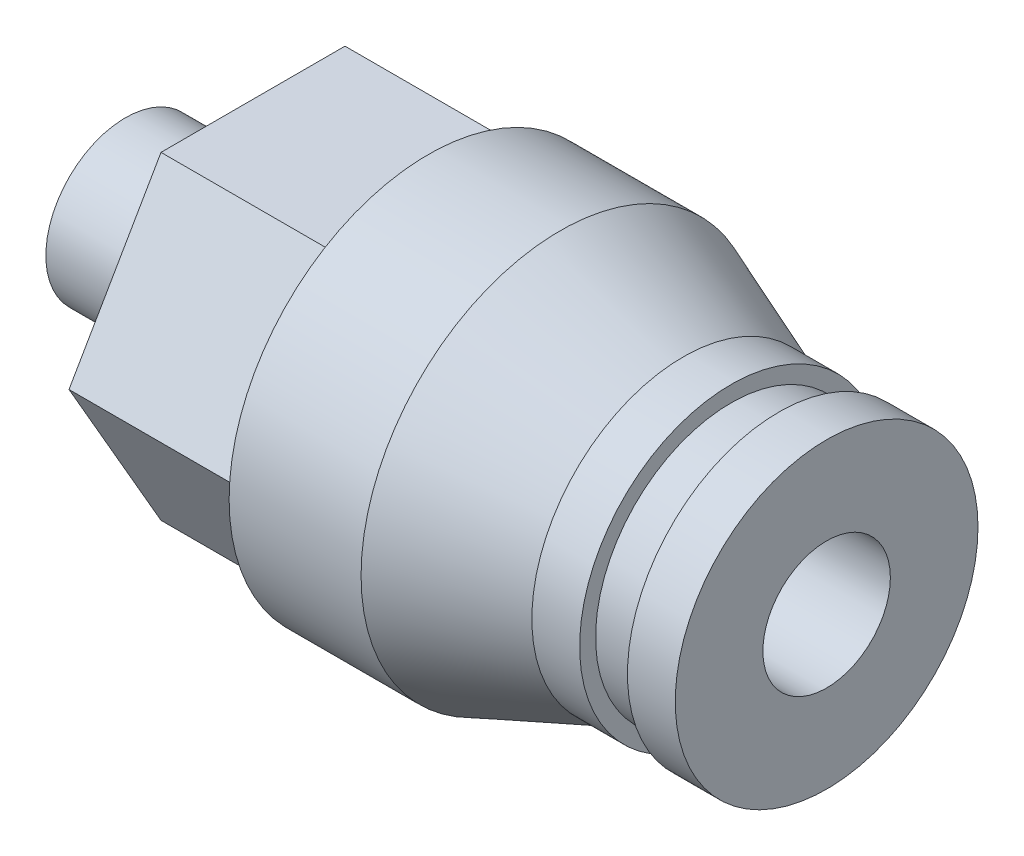
ISO-10303-21;
HEADER;
FILE_DESCRIPTION(('STEP AP214'),'2;1');
FILE_NAME('part.step','',(''),(''),'','','');
FILE_SCHEMA(('AUTOMOTIVE_DESIGN { 1 0 10303 214 1 1 1 1 }'));
ENDSEC;
DATA;
#1=APPLICATION_CONTEXT('core data for automotive mechanical design processes');
#2=APPLICATION_PROTOCOL_DEFINITION('international standard','automotive_design',2000,#1);
#3=PRODUCT_CONTEXT('',#1,'mechanical');
#4=PRODUCT('Part','Part','',(#3));
#5=PRODUCT_RELATED_PRODUCT_CATEGORY('part','',(#4));
#6=PRODUCT_DEFINITION_FORMATION('','',#4);
#7=PRODUCT_DEFINITION_CONTEXT('part definition',#1,'design');
#8=PRODUCT_DEFINITION('design','',#6,#7);
#9=PRODUCT_DEFINITION_SHAPE('','',#8);
#10=(LENGTH_UNIT() NAMED_UNIT(*) SI_UNIT(.MILLI.,.METRE.));
#11=(NAMED_UNIT(*) PLANE_ANGLE_UNIT() SI_UNIT($,.RADIAN.));
#12=(NAMED_UNIT(*) SI_UNIT($,.STERADIAN.) SOLID_ANGLE_UNIT());
#13=UNCERTAINTY_MEASURE_WITH_UNIT(LENGTH_MEASURE(1.E-05),#10,'distance_accuracy_value','');
#14=(GEOMETRIC_REPRESENTATION_CONTEXT(3) GLOBAL_UNCERTAINTY_ASSIGNED_CONTEXT((#13)) GLOBAL_UNIT_ASSIGNED_CONTEXT((#10,
#11,#12)) REPRESENTATION_CONTEXT('',''));
#15=CARTESIAN_POINT('',(0.,0.,0.));
#16=DIRECTION('',(0.,0.,1.));
#17=DIRECTION('',(1.,0.,0.));
#18=AXIS2_PLACEMENT_3D('',#15,#16,#17);
#19=CARTESIAN_POINT('',(4.,2.5,0.));
#20=DIRECTION('',(-1.,0.,0.));
#21=DIRECTION('',(0.,0.,1.));
#22=AXIS2_PLACEMENT_3D('',#19,#20,#21);
#23=PLANE('',#22);
#24=CARTESIAN_POINT('',(4.,0.,0.));
#25=DIRECTION('',(1.,0.,0.));
#26=DIRECTION('',(0.,0.,-1.));
#27=AXIS2_PLACEMENT_3D('',#24,#25,#26);
#28=CIRCLE('',#27,2.5);
#29=CARTESIAN_POINT('',(4.,0.,-2.5));
#30=VERTEX_POINT('',#29);
#31=EDGE_CURVE('E218',#30,#30,#28,.T.);
#32=ORIENTED_EDGE('',*,*,#31,.T.);
#33=EDGE_LOOP('',(#32));
#34=FACE_BOUND('',#33,.T.);
#35=DIRECTION('',(0.,-0.866025403784439,0.5));
#36=VECTOR('',#35,1.);
#37=CARTESIAN_POINT('',(4.,0.,-5.77350269189626));
#38=LINE('',#37,#36);
#39=CARTESIAN_POINT('',(4.,0.,-5.77350269189626));
#40=VERTEX_POINT('',#39);
#41=CARTESIAN_POINT('',(4.,-5.,-2.88675134594813));
#42=VERTEX_POINT('',#41);
#43=EDGE_CURVE('E127',#40,#42,#38,.T.);
#44=ORIENTED_EDGE('',*,*,#43,.T.);
#45=DIRECTION('',(0.,0.,1.));
#46=VECTOR('',#45,1.);
#47=CARTESIAN_POINT('',(4.,-5.,-2.88675134594813));
#48=LINE('',#47,#46);
#49=CARTESIAN_POINT('',(4.,-5.,2.88675134594812));
#50=VERTEX_POINT('',#49);
#51=EDGE_CURVE('E110',#42,#50,#48,.T.);
#52=ORIENTED_EDGE('',*,*,#51,.T.);
#53=DIRECTION('',(0.,0.866025403784438,0.5));
#54=VECTOR('',#53,1.);
#55=CARTESIAN_POINT('',(4.,-5.,2.88675134594812));
#56=LINE('',#55,#54);
#57=CARTESIAN_POINT('',(4.,0.,5.77350269189626));
#58=VERTEX_POINT('',#57);
#59=EDGE_CURVE('E121',#50,#58,#56,.T.);
#60=ORIENTED_EDGE('',*,*,#59,.T.);
#61=DIRECTION('',(0.,0.866025403784438,-0.5));
#62=VECTOR('',#61,1.);
#63=CARTESIAN_POINT('',(4.,0.,5.77350269189626));
#64=LINE('',#63,#62);
#65=CARTESIAN_POINT('',(4.,5.,2.88675134594813));
#66=VERTEX_POINT('',#65);
#67=EDGE_CURVE('E30',#58,#66,#64,.T.);
#68=ORIENTED_EDGE('',*,*,#67,.T.);
#69=DIRECTION('',(0.,0.,-1.));
#70=VECTOR('',#69,1.);
#71=CARTESIAN_POINT('',(4.,5.,2.88675134594813));
#72=LINE('',#71,#70);
#73=CARTESIAN_POINT('',(4.,5.,-2.88675134594813));
#74=VERTEX_POINT('',#73);
#75=EDGE_CURVE('E131',#66,#74,#72,.T.);
#76=ORIENTED_EDGE('',*,*,#75,.T.);
#77=DIRECTION('',(0.,-0.866025403784439,-0.5));
#78=VECTOR('',#77,1.);
#79=CARTESIAN_POINT('',(4.,5.,-2.88675134594813));
#80=LINE('',#79,#78);
#81=EDGE_CURVE('E134',#74,#40,#80,.T.);
#82=ORIENTED_EDGE('',*,*,#81,.T.);
#83=EDGE_LOOP('',(#44,#52,#60,#68,#76,#82));
#84=FACE_BOUND('',#83,.T.);
#85=ADVANCED_FACE('F15',(#34,#84),#23,.T.);
#86=CARTESIAN_POINT('',(0.,0.,0.));
#87=DIRECTION('',(-1.,0.,0.));
#88=DIRECTION('',(0.,0.,1.));
#89=AXIS2_PLACEMENT_3D('',#86,#87,#88);
#90=PLANE('',#89);
#91=CARTESIAN_POINT('',(0.,0.,0.));
#92=DIRECTION('',(1.,0.,0.));
#93=DIRECTION('',(0.,0.,-1.));
#94=AXIS2_PLACEMENT_3D('',#91,#92,#93);
#95=CIRCLE('',#94,2.5);
#96=CARTESIAN_POINT('',(0.,0.,-2.5));
#97=VERTEX_POINT('',#96);
#98=EDGE_CURVE('E221',#97,#97,#95,.T.);
#99=ORIENTED_EDGE('',*,*,#98,.F.);
#100=EDGE_LOOP('',(#99));
#101=FACE_BOUND('',#100,.T.);
#102=DIRECTION('',(0.,-0.866025403784439,-0.5));
#103=VECTOR('',#102,1.);
#104=CARTESIAN_POINT('',(0.,0.,1.15470053837925));
#105=LINE('',#104,#103);
#106=CARTESIAN_POINT('',(0.,0.,1.15470053837925));
#107=VERTEX_POINT('',#106);
#108=CARTESIAN_POINT('',(0.,-1.,0.577350269189626));
#109=VERTEX_POINT('',#108);
#110=EDGE_CURVE('E176',#107,#109,#105,.T.);
#111=ORIENTED_EDGE('',*,*,#110,.T.);
#112=DIRECTION('',(0.,0.,-1.));
#113=VECTOR('',#112,1.);
#114=CARTESIAN_POINT('',(0.,-1.,0.577350269189627));
#115=LINE('',#114,#113);
#116=CARTESIAN_POINT('',(0.,-1.,-0.577350269189625));
#117=VERTEX_POINT('',#116);
#118=EDGE_CURVE('E38',#109,#117,#115,.T.);
#119=ORIENTED_EDGE('',*,*,#118,.T.);
#120=DIRECTION('',(0.,0.866025403784438,-0.5));
#121=VECTOR('',#120,1.);
#122=CARTESIAN_POINT('',(0.,-1.,-0.577350269189625));
#123=LINE('',#122,#121);
#124=CARTESIAN_POINT('',(0.,0.,-1.15470053837925));
#125=VERTEX_POINT('',#124);
#126=EDGE_CURVE('E164',#117,#125,#123,.T.);
#127=ORIENTED_EDGE('',*,*,#126,.T.);
#128=DIRECTION('',(0.,0.866025403784438,0.5));
#129=VECTOR('',#128,1.);
#130=CARTESIAN_POINT('',(0.,0.,-1.15470053837925));
#131=LINE('',#130,#129);
#132=CARTESIAN_POINT('',(0.,1.,-0.577350269189625));
#133=VERTEX_POINT('',#132);
#134=EDGE_CURVE('E167',#125,#133,#131,.T.);
#135=ORIENTED_EDGE('',*,*,#134,.T.);
#136=DIRECTION('',(0.,0.,1.));
#137=VECTOR('',#136,1.);
#138=CARTESIAN_POINT('',(0.,1.,-0.577350269189625));
#139=LINE('',#138,#137);
#140=CARTESIAN_POINT('',(0.,1.,0.577350269189627));
#141=VERTEX_POINT('',#140);
#142=EDGE_CURVE('E170',#133,#141,#139,.T.);
#143=ORIENTED_EDGE('',*,*,#142,.T.);
#144=DIRECTION('',(0.,-0.866025403784438,0.5));
#145=VECTOR('',#144,1.);
#146=CARTESIAN_POINT('',(0.,1.,0.577350269189627));
#147=LINE('',#146,#145);
#148=EDGE_CURVE('E173',#141,#107,#147,.T.);
#149=ORIENTED_EDGE('',*,*,#148,.T.);
#150=EDGE_LOOP('',(#111,#119,#127,#135,#143,#149));
#151=FACE_BOUND('',#150,.T.);
#152=ADVANCED_FACE('F17',(#101,#151),#90,.T.);
#153=CARTESIAN_POINT('',(5.99999999999999,2.,0.));
#154=DIRECTION('',(1.,0.,0.));
#155=DIRECTION('',(0.,0.,-1.));
#156=AXIS2_PLACEMENT_3D('',#153,#154,#155);
#157=PLANE('',#156);
#158=CARTESIAN_POINT('',(5.99999999999999,0.,0.));
#159=DIRECTION('',(1.,0.,0.));
#160=DIRECTION('',(0.,0.,-1.));
#161=AXIS2_PLACEMENT_3D('',#158,#159,#160);
#162=CIRCLE('',#161,2.);
#163=CARTESIAN_POINT('',(5.99999999999999,0.,-2.));
#164=VERTEX_POINT('',#163);
#165=EDGE_CURVE('E191',#164,#164,#162,.T.);
#166=ORIENTED_EDGE('',*,*,#165,.T.);
#167=EDGE_LOOP('',(#166));
#168=FACE_BOUND('',#167,.T.);
#169=DIRECTION('',(0.,-0.866025403784438,0.5));
#170=VECTOR('',#169,1.);
#171=CARTESIAN_POINT('',(5.99999999999999,1.,-1.73205080756888));
#172=LINE('',#171,#170);
#173=CARTESIAN_POINT('',(5.99999999999999,0.,-1.15470053837925));
#174=VERTEX_POINT('',#173);
#175=CARTESIAN_POINT('',(5.99999999999999,-1.,-0.577350269189625));
#176=VERTEX_POINT('',#175);
#177=EDGE_CURVE('E23',#174,#176,#172,.T.);
#178=ORIENTED_EDGE('',*,*,#177,.T.);
#179=DIRECTION('',(0.,0.,1.));
#180=VECTOR('',#179,1.);
#181=CARTESIAN_POINT('',(5.99999999999999,-1.,0.));
#182=LINE('',#181,#180);
#183=CARTESIAN_POINT('',(5.99999999999999,-1.,0.577350269189627));
#184=VERTEX_POINT('',#183);
#185=EDGE_CURVE('E9',#176,#184,#182,.T.);
#186=ORIENTED_EDGE('',*,*,#185,.T.);
#187=DIRECTION('',(0.,0.866025403784439,0.5));
#188=VECTOR('',#187,1.);
#189=CARTESIAN_POINT('',(5.99999999999999,1.,1.73205080756888));
#190=LINE('',#189,#188);
#191=CARTESIAN_POINT('',(5.99999999999999,0.,1.15470053837925));
#192=VERTEX_POINT('',#191);
#193=EDGE_CURVE('E224',#184,#192,#190,.T.);
#194=ORIENTED_EDGE('',*,*,#193,.T.);
#195=DIRECTION('',(0.,0.866025403784439,-0.5));
#196=VECTOR('',#195,1.);
#197=CARTESIAN_POINT('',(5.99999999999999,2.,0.));
#198=LINE('',#197,#196);
#199=CARTESIAN_POINT('',(5.99999999999999,1.,0.577350269189627));
#200=VERTEX_POINT('',#199);
#201=EDGE_CURVE('E227',#192,#200,#198,.T.);
#202=ORIENTED_EDGE('',*,*,#201,.T.);
#203=DIRECTION('',(0.,0.,-1.));
#204=VECTOR('',#203,1.);
#205=CARTESIAN_POINT('',(5.99999999999999,1.,0.));
#206=LINE('',#205,#204);
#207=CARTESIAN_POINT('',(5.99999999999999,1.,-0.577350269189625));
#208=VERTEX_POINT('',#207);
#209=EDGE_CURVE('E230',#200,#208,#206,.T.);
#210=ORIENTED_EDGE('',*,*,#209,.T.);
#211=DIRECTION('',(0.,-0.866025403784439,-0.5));
#212=VECTOR('',#211,1.);
#213=CARTESIAN_POINT('',(5.99999999999999,2.,0.));
#214=LINE('',#213,#212);
#215=EDGE_CURVE('E233',#208,#174,#214,.T.);
#216=ORIENTED_EDGE('',*,*,#215,.T.);
#217=EDGE_LOOP('',(#178,#186,#194,#202,#210,#216));
#218=FACE_BOUND('',#217,.T.);
#219=ADVANCED_FACE('F237',(#168,#218),#157,.T.);
#220=CARTESIAN_POINT('',(0.,0.,0.));
#221=DIRECTION('',(1.,0.,0.));
#222=DIRECTION('',(0.,0.,-1.));
#223=AXIS2_PLACEMENT_3D('',#220,#221,#222);
#224=CYLINDRICAL_SURFACE('',#223,2.5);
#225=ORIENTED_EDGE('',*,*,#98,.T.);
#226=EDGE_LOOP('',(#225));
#227=FACE_BOUND('',#226,.T.);
#228=ORIENTED_EDGE('',*,*,#31,.F.);
#229=EDGE_LOOP('',(#228));
#230=FACE_BOUND('',#229,.T.);
#231=ADVANCED_FACE('F278',(#227,#230),#224,.T.);
#232=CARTESIAN_POINT('',(0.,0.,0.));
#233=DIRECTION('',(1.,0.,0.));
#234=DIRECTION('',(0.,0.,-1.));
#235=AXIS2_PLACEMENT_3D('',#232,#233,#234);
#236=CYLINDRICAL_SURFACE('',#235,6.24920521830601);
#237=CARTESIAN_POINT('',(9.5,0.,0.));
#238=DIRECTION('',(-1.,0.,0.));
#239=DIRECTION('',(0.,0.,1.));
#240=AXIS2_PLACEMENT_3D('',#237,#238,#239);
#241=CIRCLE('',#240,6.24920521830601);
#242=CARTESIAN_POINT('',(9.5,0.,6.24920521830601));
#243=VERTEX_POINT('',#242);
#244=EDGE_CURVE('E153',#243,#243,#241,.F.);
#245=ORIENTED_EDGE('',*,*,#244,.T.);
#246=EDGE_LOOP('',(#245));
#247=FACE_BOUND('',#246,.T.);
#248=CARTESIAN_POINT('',(13.6404760179123,0.,0.));
#249=DIRECTION('',(1.,0.,0.));
#250=DIRECTION('',(0.,0.,-1.));
#251=AXIS2_PLACEMENT_3D('',#248,#249,#250);
#252=CIRCLE('',#251,6.24920521830601);
#253=CARTESIAN_POINT('',(13.6404760179123,0.,-6.24920521830601));
#254=VERTEX_POINT('',#253);
#255=EDGE_CURVE('E215',#254,#254,#252,.T.);
#256=ORIENTED_EDGE('',*,*,#255,.F.);
#257=EDGE_LOOP('',(#256));
#258=FACE_BOUND('',#257,.T.);
#259=ADVANCED_FACE('F276',(#247,#258),#236,.T.);
#260=CARTESIAN_POINT('',(17.5,0.,0.));
#261=DIRECTION('',(-1.,0.,0.));
#262=DIRECTION('',(0.,0.,1.));
#263=AXIS2_PLACEMENT_3D('',#260,#261,#262);
#264=CONICAL_SURFACE('',#263,4.75,0.370503949260774);
#265=ORIENTED_EDGE('',*,*,#255,.T.);
#266=EDGE_LOOP('',(#265));
#267=FACE_BOUND('',#266,.T.);
#268=CARTESIAN_POINT('',(17.5,0.,0.));
#269=DIRECTION('',(1.,0.,0.));
#270=DIRECTION('',(0.,0.,-1.));
#271=AXIS2_PLACEMENT_3D('',#268,#269,#270);
#272=CIRCLE('',#271,4.75);
#273=CARTESIAN_POINT('',(17.5,0.,-4.75));
#274=VERTEX_POINT('',#273);
#275=EDGE_CURVE('E212',#274,#274,#272,.T.);
#276=ORIENTED_EDGE('',*,*,#275,.F.);
#277=EDGE_LOOP('',(#276));
#278=FACE_BOUND('',#277,.T.);
#279=ADVANCED_FACE('F285',(#267,#278),#264,.T.);
#280=CARTESIAN_POINT('',(0.,0.,0.));
#281=DIRECTION('',(1.,0.,0.));
#282=DIRECTION('',(0.,0.,-1.));
#283=AXIS2_PLACEMENT_3D('',#280,#281,#282);
#284=CYLINDRICAL_SURFACE('',#283,4.75);
#285=ORIENTED_EDGE('',*,*,#275,.T.);
#286=EDGE_LOOP('',(#285));
#287=FACE_BOUND('',#286,.T.);
#288=CARTESIAN_POINT('',(19.,0.,0.));
#289=DIRECTION('',(1.,0.,0.));
#290=DIRECTION('',(0.,0.,-1.));
#291=AXIS2_PLACEMENT_3D('',#288,#289,#290);
#292=CIRCLE('',#291,4.75);
#293=CARTESIAN_POINT('',(19.,0.,-4.75));
#294=VERTEX_POINT('',#293);
#295=EDGE_CURVE('E209',#294,#294,#292,.T.);
#296=ORIENTED_EDGE('',*,*,#295,.F.);
#297=EDGE_LOOP('',(#296));
#298=FACE_BOUND('',#297,.T.);
#299=ADVANCED_FACE('F312',(#287,#298),#284,.T.);
#300=CARTESIAN_POINT('',(19.,4.75,0.));
#301=DIRECTION('',(1.,0.,0.));
#302=DIRECTION('',(0.,0.,-1.));
#303=AXIS2_PLACEMENT_3D('',#300,#301,#302);
#304=PLANE('',#303);
#305=ORIENTED_EDGE('',*,*,#295,.T.);
#306=EDGE_LOOP('',(#305));
#307=FACE_BOUND('',#306,.T.);
#308=CARTESIAN_POINT('',(19.,0.,0.));
#309=DIRECTION('',(1.,0.,0.));
#310=DIRECTION('',(0.,0.,-1.));
#311=AXIS2_PLACEMENT_3D('',#308,#309,#310);
#312=CIRCLE('',#311,4.25);
#313=CARTESIAN_POINT('',(19.,0.,-4.25));
#314=VERTEX_POINT('',#313);
#315=EDGE_CURVE('E206',#314,#314,#312,.T.);
#316=ORIENTED_EDGE('',*,*,#315,.F.);
#317=EDGE_LOOP('',(#316));
#318=FACE_BOUND('',#317,.T.);
#319=ADVANCED_FACE('F308',(#307,#318),#304,.T.);
#320=CARTESIAN_POINT('',(0.,0.,0.));
#321=DIRECTION('',(1.,0.,0.));
#322=DIRECTION('',(0.,0.,-1.));
#323=AXIS2_PLACEMENT_3D('',#320,#321,#322);
#324=CYLINDRICAL_SURFACE('',#323,4.25);
#325=ORIENTED_EDGE('',*,*,#315,.T.);
#326=EDGE_LOOP('',(#325));
#327=FACE_BOUND('',#326,.T.);
#328=CARTESIAN_POINT('',(20.5,0.,0.));
#329=DIRECTION('',(1.,0.,0.));
#330=DIRECTION('',(0.,0.,-1.));
#331=AXIS2_PLACEMENT_3D('',#328,#329,#330);
#332=CIRCLE('',#331,4.25);
#333=CARTESIAN_POINT('',(20.5,0.,-4.25));
#334=VERTEX_POINT('',#333);
#335=EDGE_CURVE('E203',#334,#334,#332,.T.);
#336=ORIENTED_EDGE('',*,*,#335,.F.);
#337=EDGE_LOOP('',(#336));
#338=FACE_BOUND('',#337,.T.);
#339=ADVANCED_FACE('F304',(#327,#338),#324,.T.);
#340=CARTESIAN_POINT('',(20.5,4.25,0.));
#341=DIRECTION('',(-1.,0.,0.));
#342=DIRECTION('',(0.,0.,1.));
#343=AXIS2_PLACEMENT_3D('',#340,#341,#342);
#344=PLANE('',#343);
#345=ORIENTED_EDGE('',*,*,#335,.T.);
#346=EDGE_LOOP('',(#345));
#347=FACE_BOUND('',#346,.T.);
#348=CARTESIAN_POINT('',(20.5,0.,0.));
#349=DIRECTION('',(1.,0.,0.));
#350=DIRECTION('',(0.,0.,-1.));
#351=AXIS2_PLACEMENT_3D('',#348,#349,#350);
#352=CIRCLE('',#351,4.75);
#353=CARTESIAN_POINT('',(20.5,0.,-4.75));
#354=VERTEX_POINT('',#353);
#355=EDGE_CURVE('E200',#354,#354,#352,.T.);
#356=ORIENTED_EDGE('',*,*,#355,.F.);
#357=EDGE_LOOP('',(#356));
#358=FACE_BOUND('',#357,.T.);
#359=ADVANCED_FACE('F300',(#347,#358),#344,.T.);
#360=CARTESIAN_POINT('',(0.,0.,0.));
#361=DIRECTION('',(1.,0.,0.));
#362=DIRECTION('',(0.,0.,-1.));
#363=AXIS2_PLACEMENT_3D('',#360,#361,#362);
#364=CYLINDRICAL_SURFACE('',#363,4.75);
#365=ORIENTED_EDGE('',*,*,#355,.T.);
#366=EDGE_LOOP('',(#365));
#367=FACE_BOUND('',#366,.T.);
#368=CARTESIAN_POINT('',(22.,0.,0.));
#369=DIRECTION('',(1.,0.,0.));
#370=DIRECTION('',(0.,0.,-1.));
#371=AXIS2_PLACEMENT_3D('',#368,#369,#370);
#372=CIRCLE('',#371,4.75);
#373=CARTESIAN_POINT('',(22.,0.,-4.75));
#374=VERTEX_POINT('',#373);
#375=EDGE_CURVE('E197',#374,#374,#372,.T.);
#376=ORIENTED_EDGE('',*,*,#375,.F.);
#377=EDGE_LOOP('',(#376));
#378=FACE_BOUND('',#377,.T.);
#379=ADVANCED_FACE('F296',(#367,#378),#364,.T.);
#380=CARTESIAN_POINT('',(22.,4.75,0.));
#381=DIRECTION('',(1.,0.,0.));
#382=DIRECTION('',(0.,0.,-1.));
#383=AXIS2_PLACEMENT_3D('',#380,#381,#382);
#384=PLANE('',#383);
#385=ORIENTED_EDGE('',*,*,#375,.T.);
#386=EDGE_LOOP('',(#385));
#387=FACE_BOUND('',#386,.T.);
#388=CARTESIAN_POINT('',(22.,0.,0.));
#389=DIRECTION('',(1.,0.,0.));
#390=DIRECTION('',(0.,0.,-1.));
#391=AXIS2_PLACEMENT_3D('',#388,#389,#390);
#392=CIRCLE('',#391,2.);
#393=CARTESIAN_POINT('',(22.,0.,-2.));
#394=VERTEX_POINT('',#393);
#395=EDGE_CURVE('E194',#394,#394,#392,.T.);
#396=ORIENTED_EDGE('',*,*,#395,.F.);
#397=EDGE_LOOP('',(#396));
#398=FACE_BOUND('',#397,.T.);
#399=ADVANCED_FACE('F264',(#387,#398),#384,.T.);
#400=CARTESIAN_POINT('',(0.,0.,0.));
#401=DIRECTION('',(1.,0.,0.));
#402=DIRECTION('',(0.,0.,-1.));
#403=AXIS2_PLACEMENT_3D('',#400,#401,#402);
#404=CYLINDRICAL_SURFACE('',#403,2.);
#405=ORIENTED_EDGE('',*,*,#395,.T.);
#406=EDGE_LOOP('',(#405));
#407=FACE_BOUND('',#406,.T.);
#408=ORIENTED_EDGE('',*,*,#165,.F.);
#409=EDGE_LOOP('',(#408));
#410=FACE_BOUND('',#409,.T.);
#411=ADVANCED_FACE('F256',(#407,#410),#404,.F.);
#412=CARTESIAN_POINT('',(22.,-1.,0.577350269189627));
#413=DIRECTION('',(0.,1.,0.));
#414=DIRECTION('',(0.,0.,1.));
#415=AXIS2_PLACEMENT_3D('',#412,#413,#414);
#416=PLANE('',#415);
#417=DIRECTION('',(-1.,0.,0.));
#418=VECTOR('',#417,1.);
#419=CARTESIAN_POINT('',(22.,-1.,-0.577350269189625));
#420=LINE('',#419,#418);
#421=EDGE_CURVE('E189',#176,#117,#420,.T.);
#422=ORIENTED_EDGE('',*,*,#421,.T.);
#423=ORIENTED_EDGE('',*,*,#118,.F.);
#424=DIRECTION('',(-1.,0.,0.));
#425=VECTOR('',#424,1.);
#426=CARTESIAN_POINT('',(22.,-1.,0.577350269189627));
#427=LINE('',#426,#425);
#428=EDGE_CURVE('E179',#184,#109,#427,.T.);
#429=ORIENTED_EDGE('',*,*,#428,.F.);
#430=ORIENTED_EDGE('',*,*,#185,.F.);
#431=EDGE_LOOP('',(#422,#423,#429,#430));
#432=FACE_BOUND('',#431,.T.);
#433=ADVANCED_FACE('F254',(#432),#416,.T.);
#434=CARTESIAN_POINT('',(22.,-1.,-0.577350269189625));
#435=DIRECTION('',(0.,0.5,0.866025403784438));
#436=DIRECTION('',(0.,-0.866025403784438,0.5));
#437=AXIS2_PLACEMENT_3D('',#434,#435,#436);
#438=PLANE('',#437);
#439=DIRECTION('',(-1.,0.,0.));
#440=VECTOR('',#439,1.);
#441=CARTESIAN_POINT('',(22.,0.,-1.15470053837925));
#442=LINE('',#441,#440);
#443=EDGE_CURVE('E187',#174,#125,#442,.T.);
#444=ORIENTED_EDGE('',*,*,#443,.T.);
#445=ORIENTED_EDGE('',*,*,#126,.F.);
#446=ORIENTED_EDGE('',*,*,#421,.F.);
#447=ORIENTED_EDGE('',*,*,#177,.F.);
#448=EDGE_LOOP('',(#444,#445,#446,#447));
#449=FACE_BOUND('',#448,.T.);
#450=ADVANCED_FACE('F241',(#449),#438,.T.);
#451=CARTESIAN_POINT('',(22.,0.,-1.15470053837925));
#452=DIRECTION('',(0.,-0.5,0.866025403784438));
#453=DIRECTION('',(0.,-0.866025403784439,-0.5));
#454=AXIS2_PLACEMENT_3D('',#451,#452,#453);
#455=PLANE('',#454);
#456=DIRECTION('',(-1.,0.,0.));
#457=VECTOR('',#456,1.);
#458=CARTESIAN_POINT('',(22.,1.,-0.577350269189625));
#459=LINE('',#458,#457);
#460=EDGE_CURVE('E185',#208,#133,#459,.T.);
#461=ORIENTED_EDGE('',*,*,#460,.T.);
#462=ORIENTED_EDGE('',*,*,#134,.F.);
#463=ORIENTED_EDGE('',*,*,#443,.F.);
#464=ORIENTED_EDGE('',*,*,#215,.F.);
#465=EDGE_LOOP('',(#461,#462,#463,#464));
#466=FACE_BOUND('',#465,.T.);
#467=ADVANCED_FACE('F245',(#466),#455,.T.);
#468=CARTESIAN_POINT('',(22.,1.,-0.577350269189625));
#469=DIRECTION('',(0.,-1.,0.));
#470=DIRECTION('',(0.,0.,-1.));
#471=AXIS2_PLACEMENT_3D('',#468,#469,#470);
#472=PLANE('',#471);
#473=DIRECTION('',(-1.,0.,0.));
#474=VECTOR('',#473,1.);
#475=CARTESIAN_POINT('',(22.,1.,0.577350269189627));
#476=LINE('',#475,#474);
#477=EDGE_CURVE('E183',#200,#141,#476,.T.);
#478=ORIENTED_EDGE('',*,*,#477,.T.);
#479=ORIENTED_EDGE('',*,*,#142,.F.);
#480=ORIENTED_EDGE('',*,*,#460,.F.);
#481=ORIENTED_EDGE('',*,*,#209,.F.);
#482=EDGE_LOOP('',(#478,#479,#480,#481));
#483=FACE_BOUND('',#482,.T.);
#484=ADVANCED_FACE('F401',(#483),#472,.T.);
#485=CARTESIAN_POINT('',(22.,1.,0.577350269189627));
#486=DIRECTION('',(0.,-0.5,-0.866025403784439));
#487=DIRECTION('',(0.,0.866025403784439,-0.5));
#488=AXIS2_PLACEMENT_3D('',#485,#486,#487);
#489=PLANE('',#488);
#490=DIRECTION('',(-1.,0.,0.));
#491=VECTOR('',#490,1.);
#492=CARTESIAN_POINT('',(22.,0.,1.15470053837925));
#493=LINE('',#492,#491);
#494=EDGE_CURVE('E181',#192,#107,#493,.T.);
#495=ORIENTED_EDGE('',*,*,#494,.T.);
#496=ORIENTED_EDGE('',*,*,#148,.F.);
#497=ORIENTED_EDGE('',*,*,#477,.F.);
#498=ORIENTED_EDGE('',*,*,#201,.F.);
#499=EDGE_LOOP('',(#495,#496,#497,#498));
#500=FACE_BOUND('',#499,.T.);
#501=ADVANCED_FACE('F410',(#500),#489,.T.);
#502=CARTESIAN_POINT('',(22.,0.,1.15470053837925));
#503=DIRECTION('',(0.,0.5,-0.866025403784439));
#504=DIRECTION('',(0.,0.866025403784439,0.5));
#505=AXIS2_PLACEMENT_3D('',#502,#503,#504);
#506=PLANE('',#505);
#507=ORIENTED_EDGE('',*,*,#428,.T.);
#508=ORIENTED_EDGE('',*,*,#110,.F.);
#509=ORIENTED_EDGE('',*,*,#494,.F.);
#510=ORIENTED_EDGE('',*,*,#193,.F.);
#511=EDGE_LOOP('',(#507,#508,#509,#510));
#512=FACE_BOUND('',#511,.T.);
#513=ADVANCED_FACE('F252',(#512),#506,.T.);
#514=CARTESIAN_POINT('',(9.5,0.,0.));
#515=DIRECTION('',(-1.,0.,0.));
#516=DIRECTION('',(0.,0.,1.));
#517=AXIS2_PLACEMENT_3D('',#514,#515,#516);
#518=PLANE('',#517);
#519=ORIENTED_EDGE('',*,*,#244,.F.);
#520=EDGE_LOOP('',(#519));
#521=FACE_BOUND('',#520,.T.);
#522=DIRECTION('',(0.,-0.866025403784439,0.5));
#523=VECTOR('',#522,1.);
#524=CARTESIAN_POINT('',(9.5,0.,-5.77350269189626));
#525=LINE('',#524,#523);
#526=CARTESIAN_POINT('',(9.5,0.,-5.77350269189626));
#527=VERTEX_POINT('',#526);
#528=CARTESIAN_POINT('',(9.5,-5.,-2.88675134594813));
#529=VERTEX_POINT('',#528);
#530=EDGE_CURVE('E118',#527,#529,#525,.T.);
#531=ORIENTED_EDGE('',*,*,#530,.F.);
#532=DIRECTION('',(0.,-0.866025403784439,-0.5));
#533=VECTOR('',#532,1.);
#534=CARTESIAN_POINT('',(9.5,5.,-2.88675134594813));
#535=LINE('',#534,#533);
#536=CARTESIAN_POINT('',(9.5,5.,-2.88675134594813));
#537=VERTEX_POINT('',#536);
#538=EDGE_CURVE('E146',#537,#527,#535,.T.);
#539=ORIENTED_EDGE('',*,*,#538,.F.);
#540=DIRECTION('',(0.,0.,-1.));
#541=VECTOR('',#540,1.);
#542=CARTESIAN_POINT('',(9.5,5.,2.88675134594813));
#543=LINE('',#542,#541);
#544=CARTESIAN_POINT('',(9.5,5.,2.88675134594813));
#545=VERTEX_POINT('',#544);
#546=EDGE_CURVE('E143',#545,#537,#543,.T.);
#547=ORIENTED_EDGE('',*,*,#546,.F.);
#548=DIRECTION('',(0.,0.866025403784438,-0.5));
#549=VECTOR('',#548,1.);
#550=CARTESIAN_POINT('',(9.5,0.,5.77350269189626));
#551=LINE('',#550,#549);
#552=CARTESIAN_POINT('',(9.5,0.,5.77350269189626));
#553=VERTEX_POINT('',#552);
#554=EDGE_CURVE('E140',#553,#545,#551,.T.);
#555=ORIENTED_EDGE('',*,*,#554,.F.);
#556=DIRECTION('',(0.,0.866025403784438,0.5));
#557=VECTOR('',#556,1.);
#558=CARTESIAN_POINT('',(9.5,-5.,2.88675134594812));
#559=LINE('',#558,#557);
#560=CARTESIAN_POINT('',(9.5,-5.,2.88675134594812));
#561=VERTEX_POINT('',#560);
#562=EDGE_CURVE('E138',#561,#553,#559,.T.);
#563=ORIENTED_EDGE('',*,*,#562,.F.);
#564=DIRECTION('',(0.,0.,1.));
#565=VECTOR('',#564,1.);
#566=CARTESIAN_POINT('',(9.5,-5.,-2.88675134594813));
#567=LINE('',#566,#565);
#568=EDGE_CURVE('E113',#529,#561,#567,.T.);
#569=ORIENTED_EDGE('',*,*,#568,.F.);
#570=EDGE_LOOP('',(#531,#539,#547,#555,#563,#569));
#571=FACE_BOUND('',#570,.T.);
#572=ADVANCED_FACE('F429',(#521,#571),#518,.T.);
#573=CARTESIAN_POINT('',(9.5,-5.,-2.88675134594813));
#574=DIRECTION('',(0.,-1.,0.));
#575=DIRECTION('',(0.,0.,-1.));
#576=AXIS2_PLACEMENT_3D('',#573,#574,#575);
#577=PLANE('',#576);
#578=DIRECTION('',(-1.,0.,0.));
#579=VECTOR('',#578,1.);
#580=CARTESIAN_POINT('',(9.5,-5.,-2.88675134594813));
#581=LINE('',#580,#579);
#582=EDGE_CURVE('E151',#529,#42,#581,.T.);
#583=ORIENTED_EDGE('',*,*,#582,.F.);
#584=ORIENTED_EDGE('',*,*,#568,.T.);
#585=DIRECTION('',(-1.,0.,0.));
#586=VECTOR('',#585,1.);
#587=CARTESIAN_POINT('',(9.5,-5.,2.88675134594812));
#588=LINE('',#587,#586);
#589=EDGE_CURVE('E106',#561,#50,#588,.T.);
#590=ORIENTED_EDGE('',*,*,#589,.T.);
#591=ORIENTED_EDGE('',*,*,#51,.F.);
#592=EDGE_LOOP('',(#583,#584,#590,#591));
#593=FACE_BOUND('',#592,.T.);
#594=ADVANCED_FACE('F108',(#593),#577,.T.);
#595=CARTESIAN_POINT('',(9.5,0.,-5.77350269189626));
#596=DIRECTION('',(0.,-0.5,-0.866025403784439));
#597=DIRECTION('',(0.,0.866025403784439,-0.5));
#598=AXIS2_PLACEMENT_3D('',#595,#596,#597);
#599=PLANE('',#598);
#600=DIRECTION('',(-1.,0.,0.));
#601=VECTOR('',#600,1.);
#602=CARTESIAN_POINT('',(9.5,0.,-5.77350269189626));
#603=LINE('',#602,#601);
#604=EDGE_CURVE('E154',#527,#40,#603,.T.);
#605=ORIENTED_EDGE('',*,*,#604,.F.);
#606=ORIENTED_EDGE('',*,*,#530,.T.);
#607=ORIENTED_EDGE('',*,*,#582,.T.);
#608=ORIENTED_EDGE('',*,*,#43,.F.);
#609=EDGE_LOOP('',(#605,#606,#607,#608));
#610=FACE_BOUND('',#609,.T.);
#611=ADVANCED_FACE('F447',(#610),#599,.T.);
#612=CARTESIAN_POINT('',(9.5,5.,-2.88675134594813));
#613=DIRECTION('',(0.,0.5,-0.866025403784439));
#614=DIRECTION('',(0.,0.866025403784439,0.5));
#615=AXIS2_PLACEMENT_3D('',#612,#613,#614);
#616=PLANE('',#615);
#617=DIRECTION('',(-1.,0.,0.));
#618=VECTOR('',#617,1.);
#619=CARTESIAN_POINT('',(9.5,5.,-2.88675134594813));
#620=LINE('',#619,#618);
#621=EDGE_CURVE('E156',#537,#74,#620,.T.);
#622=ORIENTED_EDGE('',*,*,#621,.F.);
#623=ORIENTED_EDGE('',*,*,#538,.T.);
#624=ORIENTED_EDGE('',*,*,#604,.T.);
#625=ORIENTED_EDGE('',*,*,#81,.F.);
#626=EDGE_LOOP('',(#622,#623,#624,#625));
#627=FACE_BOUND('',#626,.T.);
#628=ADVANCED_FACE('F456',(#627),#616,.T.);
#629=CARTESIAN_POINT('',(9.5,5.,2.88675134594813));
#630=DIRECTION('',(0.,1.,0.));
#631=DIRECTION('',(0.,0.,1.));
#632=AXIS2_PLACEMENT_3D('',#629,#630,#631);
#633=PLANE('',#632);
#634=DIRECTION('',(-1.,0.,0.));
#635=VECTOR('',#634,1.);
#636=CARTESIAN_POINT('',(9.5,5.,2.88675134594813));
#637=LINE('',#636,#635);
#638=EDGE_CURVE('E158',#545,#66,#637,.T.);
#639=ORIENTED_EDGE('',*,*,#638,.F.);
#640=ORIENTED_EDGE('',*,*,#546,.T.);
#641=ORIENTED_EDGE('',*,*,#621,.T.);
#642=ORIENTED_EDGE('',*,*,#75,.F.);
#643=EDGE_LOOP('',(#639,#640,#641,#642));
#644=FACE_BOUND('',#643,.T.);
#645=ADVANCED_FACE('F466',(#644),#633,.T.);
#646=CARTESIAN_POINT('',(9.5,0.,5.77350269189626));
#647=DIRECTION('',(0.,0.5,0.866025403784439));
#648=DIRECTION('',(0.,-0.866025403784439,0.5));
#649=AXIS2_PLACEMENT_3D('',#646,#647,#648);
#650=PLANE('',#649);
#651=DIRECTION('',(-1.,0.,0.));
#652=VECTOR('',#651,1.);
#653=CARTESIAN_POINT('',(9.5,0.,5.77350269189626));
#654=LINE('',#653,#652);
#655=EDGE_CURVE('E117',#553,#58,#654,.T.);
#656=ORIENTED_EDGE('',*,*,#655,.F.);
#657=ORIENTED_EDGE('',*,*,#554,.T.);
#658=ORIENTED_EDGE('',*,*,#638,.T.);
#659=ORIENTED_EDGE('',*,*,#67,.F.);
#660=EDGE_LOOP('',(#656,#657,#658,#659));
#661=FACE_BOUND('',#660,.T.);
#662=ADVANCED_FACE('F476',(#661),#650,.T.);
#663=CARTESIAN_POINT('',(9.5,-5.,2.88675134594812));
#664=DIRECTION('',(0.,-0.5,0.866025403784439));
#665=DIRECTION('',(0.,-0.866025403784439,-0.5));
#666=AXIS2_PLACEMENT_3D('',#663,#664,#665);
#667=PLANE('',#666);
#668=ORIENTED_EDGE('',*,*,#589,.F.);
#669=ORIENTED_EDGE('',*,*,#562,.T.);
#670=ORIENTED_EDGE('',*,*,#655,.T.);
#671=ORIENTED_EDGE('',*,*,#59,.F.);
#672=EDGE_LOOP('',(#668,#669,#670,#671));
#673=FACE_BOUND('',#672,.T.);
#674=ADVANCED_FACE('F122',(#673),#667,.T.);
#675=CLOSED_SHELL('',(#85,#152,#219,#231,#259,#279,#299,#319,#339,#359,#379,#399,#411,#433,#450,
#467,#484,#501,#513,#572,#594,#611,#628,#645,#662,#674));
#676=MANIFOLD_SOLID_BREP('B1',#675);
#677=ADVANCED_BREP_SHAPE_REPRESENTATION('',(#18,#676),#14);
#678=SHAPE_DEFINITION_REPRESENTATION(#9,#677);
ENDSEC;
END-ISO-10303-21;
